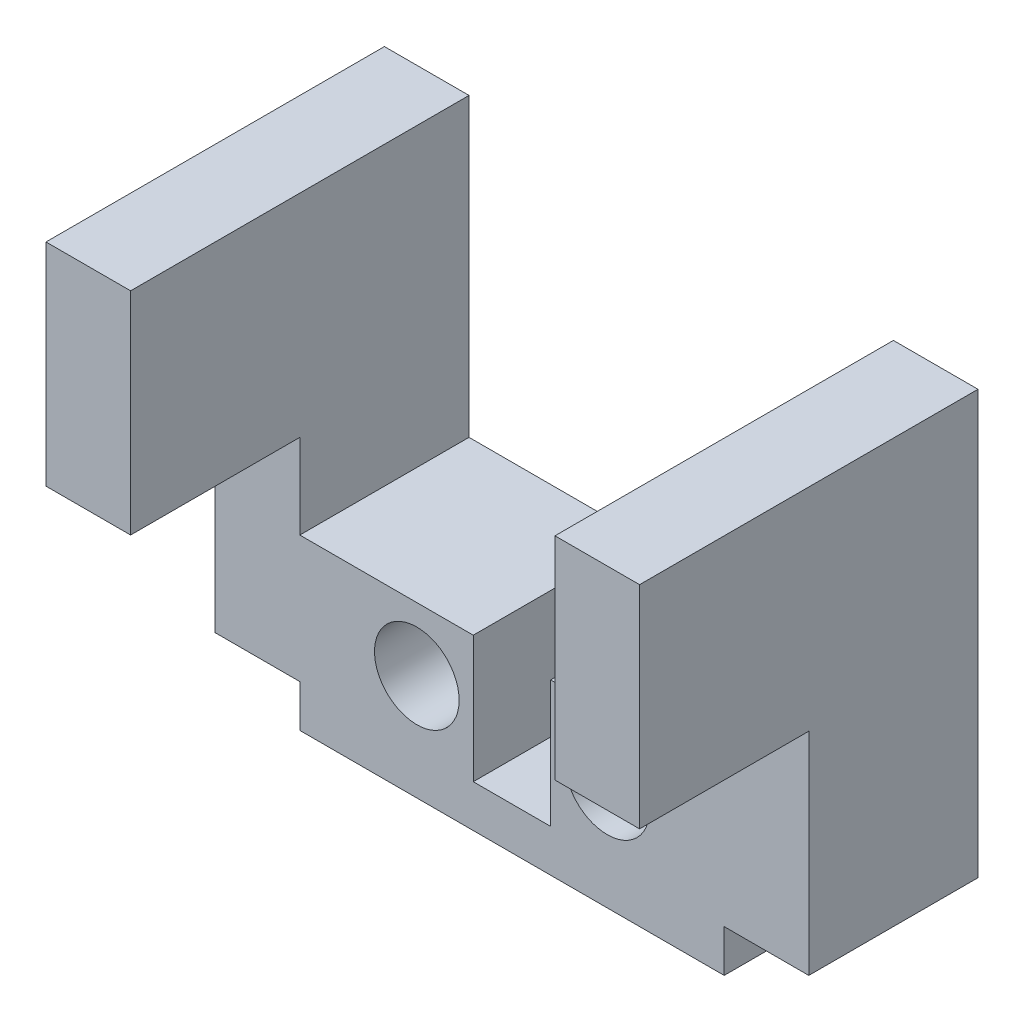
ISO-10303-21;
HEADER;
FILE_DESCRIPTION(('STEP AP214'),'2;1');
FILE_NAME('part.step','',(''),(''),'','','');
FILE_SCHEMA(('AUTOMOTIVE_DESIGN { 1 0 10303 214 1 1 1 1 }'));
ENDSEC;
DATA;
#1=APPLICATION_CONTEXT('core data for automotive mechanical design processes');
#2=APPLICATION_PROTOCOL_DEFINITION('international standard','automotive_design',2000,#1);
#3=PRODUCT_CONTEXT('',#1,'mechanical');
#4=PRODUCT('Part','Part','',(#3));
#5=PRODUCT_RELATED_PRODUCT_CATEGORY('part','',(#4));
#6=PRODUCT_DEFINITION_FORMATION('','',#4);
#7=PRODUCT_DEFINITION_CONTEXT('part definition',#1,'design');
#8=PRODUCT_DEFINITION('design','',#6,#7);
#9=PRODUCT_DEFINITION_SHAPE('','',#8);
#10=(LENGTH_UNIT() NAMED_UNIT(*) SI_UNIT(.MILLI.,.METRE.));
#11=(NAMED_UNIT(*) PLANE_ANGLE_UNIT() SI_UNIT($,.RADIAN.));
#12=(NAMED_UNIT(*) SI_UNIT($,.STERADIAN.) SOLID_ANGLE_UNIT());
#13=UNCERTAINTY_MEASURE_WITH_UNIT(LENGTH_MEASURE(1.E-05),#10,'distance_accuracy_value','');
#14=(GEOMETRIC_REPRESENTATION_CONTEXT(3) GLOBAL_UNCERTAINTY_ASSIGNED_CONTEXT((#13)) GLOBAL_UNIT_ASSIGNED_CONTEXT((#10,
#11,#12)) REPRESENTATION_CONTEXT('',''));
#15=CARTESIAN_POINT('',(0.,0.,0.));
#16=DIRECTION('',(0.,0.,1.));
#17=DIRECTION('',(1.,0.,0.));
#18=AXIS2_PLACEMENT_3D('',#15,#16,#17);
#19=CARTESIAN_POINT('',(0.,0.,8.));
#20=DIRECTION('',(0.,0.,-1.));
#21=DIRECTION('',(-1.,0.,0.));
#22=AXIS2_PLACEMENT_3D('',#19,#20,#21);
#23=PLANE('',#22);
#24=CARTESIAN_POINT('',(-4.5,0.,8.));
#25=DIRECTION('',(0.,0.,1.));
#26=DIRECTION('',(1.,0.,0.));
#27=AXIS2_PLACEMENT_3D('',#24,#25,#26);
#28=CIRCLE('',#27,2.);
#29=CARTESIAN_POINT('',(-2.5,0.,8.));
#30=VERTEX_POINT('',#29);
#31=EDGE_CURVE('E249',#30,#30,#28,.T.);
#32=ORIENTED_EDGE('',*,*,#31,.F.);
#33=EDGE_LOOP('',(#32));
#34=FACE_BOUND('',#33,.T.);
#35=CARTESIAN_POINT('',(4.5,0.,8.));
#36=DIRECTION('',(0.,0.,1.));
#37=DIRECTION('',(-1.,0.,0.));
#38=AXIS2_PLACEMENT_3D('',#35,#36,#37);
#39=CIRCLE('',#38,2.);
#40=CARTESIAN_POINT('',(2.5,0.,8.));
#41=VERTEX_POINT('',#40);
#42=EDGE_CURVE('E241',#41,#41,#39,.T.);
#43=ORIENTED_EDGE('',*,*,#42,.F.);
#44=EDGE_LOOP('',(#43));
#45=FACE_BOUND('',#44,.T.);
#46=DIRECTION('',(1.,0.,0.));
#47=VECTOR('',#46,1.);
#48=CARTESIAN_POINT('',(14.0312899135856,7.,8.));
#49=LINE('',#48,#47);
#50=CARTESIAN_POINT('',(10.0312899135856,7.,8.));
#51=VERTEX_POINT('',#50);
#52=CARTESIAN_POINT('',(14.0312899135856,7.,8.));
#53=VERTEX_POINT('',#52);
#54=EDGE_CURVE('E199',#51,#53,#49,.T.);
#55=ORIENTED_EDGE('',*,*,#54,.F.);
#56=DIRECTION('',(0.,-1.,0.));
#57=VECTOR('',#56,1.);
#58=CARTESIAN_POINT('',(10.0312899135856,3.,8.));
#59=LINE('',#58,#57);
#60=CARTESIAN_POINT('',(10.0312899135856,3.,8.));
#61=VERTEX_POINT('',#60);
#62=EDGE_CURVE('E258',#51,#61,#59,.T.);
#63=ORIENTED_EDGE('',*,*,#62,.T.);
#64=DIRECTION('',(-1.,0.,0.));
#65=VECTOR('',#64,1.);
#66=CARTESIAN_POINT('',(1.83128991358563,3.,8.));
#67=LINE('',#66,#65);
#68=CARTESIAN_POINT('',(1.83128991358563,3.,8.));
#69=VERTEX_POINT('',#68);
#70=EDGE_CURVE('E262',#61,#69,#67,.T.);
#71=ORIENTED_EDGE('',*,*,#70,.T.);
#72=DIRECTION('',(0.,-1.,0.));
#73=VECTOR('',#72,1.);
#74=CARTESIAN_POINT('',(1.83128991358563,-3.,8.));
#75=LINE('',#74,#73);
#76=CARTESIAN_POINT('',(1.83128991358563,-3.,8.));
#77=VERTEX_POINT('',#76);
#78=EDGE_CURVE('E265',#69,#77,#75,.T.);
#79=ORIENTED_EDGE('',*,*,#78,.T.);
#80=DIRECTION('',(-1.,0.,0.));
#81=VECTOR('',#80,1.);
#82=CARTESIAN_POINT('',(1.83128991358563,-3.,8.));
#83=LINE('',#82,#81);
#84=CARTESIAN_POINT('',(-1.83128991358563,-3.,8.));
#85=VERTEX_POINT('',#84);
#86=EDGE_CURVE('E268',#77,#85,#83,.T.);
#87=ORIENTED_EDGE('',*,*,#86,.T.);
#88=DIRECTION('',(0.,1.,0.));
#89=VECTOR('',#88,1.);
#90=CARTESIAN_POINT('',(-1.83128991358563,-3.,8.));
#91=LINE('',#90,#89);
#92=CARTESIAN_POINT('',(-1.83128991358563,3.,8.));
#93=VERTEX_POINT('',#92);
#94=EDGE_CURVE('E271',#85,#93,#91,.T.);
#95=ORIENTED_EDGE('',*,*,#94,.T.);
#96=DIRECTION('',(-1.,0.,0.));
#97=VECTOR('',#96,1.);
#98=CARTESIAN_POINT('',(-1.83128991358563,3.,8.));
#99=LINE('',#98,#97);
#100=CARTESIAN_POINT('',(-10.0312899135856,3.,8.));
#101=VERTEX_POINT('',#100);
#102=EDGE_CURVE('E274',#93,#101,#99,.T.);
#103=ORIENTED_EDGE('',*,*,#102,.T.);
#104=DIRECTION('',(0.,1.,0.));
#105=VECTOR('',#104,1.);
#106=CARTESIAN_POINT('',(-10.0312899135856,3.,8.));
#107=LINE('',#106,#105);
#108=CARTESIAN_POINT('',(-10.0312899135856,7.,8.));
#109=VERTEX_POINT('',#108);
#110=EDGE_CURVE('E277',#101,#109,#107,.T.);
#111=ORIENTED_EDGE('',*,*,#110,.T.);
#112=DIRECTION('',(1.,0.,0.));
#113=VECTOR('',#112,1.);
#114=CARTESIAN_POINT('',(-14.0312899135856,7.,8.));
#115=LINE('',#114,#113);
#116=CARTESIAN_POINT('',(-14.0312899135856,7.,8.));
#117=VERTEX_POINT('',#116);
#118=EDGE_CURVE('E62',#117,#109,#115,.T.);
#119=ORIENTED_EDGE('',*,*,#118,.F.);
#120=DIRECTION('',(0.,-1.,0.));
#121=VECTOR('',#120,1.);
#122=CARTESIAN_POINT('',(-14.0312899135856,-3.,8.));
#123=LINE('',#122,#121);
#124=CARTESIAN_POINT('',(-14.0312899135856,-3.,8.));
#125=VERTEX_POINT('',#124);
#126=EDGE_CURVE('E280',#117,#125,#123,.T.);
#127=ORIENTED_EDGE('',*,*,#126,.T.);
#128=DIRECTION('',(1.,0.,0.));
#129=VECTOR('',#128,1.);
#130=CARTESIAN_POINT('',(-10.0312899135856,-3.,8.));
#131=LINE('',#130,#129);
#132=CARTESIAN_POINT('',(-10.0312899135856,-3.,8.));
#133=VERTEX_POINT('',#132);
#134=EDGE_CURVE('E283',#125,#133,#131,.T.);
#135=ORIENTED_EDGE('',*,*,#134,.T.);
#136=DIRECTION('',(0.,-1.,0.));
#137=VECTOR('',#136,1.);
#138=CARTESIAN_POINT('',(-10.0312899135856,-3.,8.));
#139=LINE('',#138,#137);
#140=CARTESIAN_POINT('',(-10.0312899135856,-5.,8.));
#141=VERTEX_POINT('',#140);
#142=EDGE_CURVE('E286',#133,#141,#139,.T.);
#143=ORIENTED_EDGE('',*,*,#142,.T.);
#144=DIRECTION('',(1.,0.,0.));
#145=VECTOR('',#144,1.);
#146=CARTESIAN_POINT('',(-10.0312899135856,-5.,8.));
#147=LINE('',#146,#145);
#148=CARTESIAN_POINT('',(10.0312899135856,-5.,8.));
#149=VERTEX_POINT('',#148);
#150=EDGE_CURVE('E289',#141,#149,#147,.T.);
#151=ORIENTED_EDGE('',*,*,#150,.T.);
#152=DIRECTION('',(0.,1.,0.));
#153=VECTOR('',#152,1.);
#154=CARTESIAN_POINT('',(10.0312899135856,-5.,8.));
#155=LINE('',#154,#153);
#156=CARTESIAN_POINT('',(10.0312899135856,-3.,8.));
#157=VERTEX_POINT('',#156);
#158=EDGE_CURVE('E292',#149,#157,#155,.T.);
#159=ORIENTED_EDGE('',*,*,#158,.T.);
#160=DIRECTION('',(1.,0.,0.));
#161=VECTOR('',#160,1.);
#162=CARTESIAN_POINT('',(10.0312899135856,-3.,8.));
#163=LINE('',#162,#161);
#164=CARTESIAN_POINT('',(14.0312899135856,-3.,8.));
#165=VERTEX_POINT('',#164);
#166=EDGE_CURVE('E295',#157,#165,#163,.T.);
#167=ORIENTED_EDGE('',*,*,#166,.T.);
#168=DIRECTION('',(0.,1.,0.));
#169=VECTOR('',#168,1.);
#170=CARTESIAN_POINT('',(14.0312899135856,-3.,8.));
#171=LINE('',#170,#169);
#172=EDGE_CURVE('E55',#165,#53,#171,.T.);
#173=ORIENTED_EDGE('',*,*,#172,.T.);
#174=EDGE_LOOP('',(#55,#63,#71,#79,#87,#95,#103,#111,#119,#127,#135,#143,#151,#159,#167,#173));
#175=FACE_BOUND('',#174,.T.);
#176=ADVANCED_FACE('F39',(#34,#45,#175),#23,.F.);
#177=CARTESIAN_POINT('',(0.,0.,0.));
#178=DIRECTION('',(0.,0.,-1.));
#179=DIRECTION('',(-1.,0.,0.));
#180=AXIS2_PLACEMENT_3D('',#177,#178,#179);
#181=PLANE('',#180);
#182=CARTESIAN_POINT('',(-4.5,0.,0.));
#183=DIRECTION('',(0.,0.,1.));
#184=DIRECTION('',(1.,0.,0.));
#185=AXIS2_PLACEMENT_3D('',#182,#183,#184);
#186=CIRCLE('',#185,2.);
#187=CARTESIAN_POINT('',(-2.5,0.,0.));
#188=VERTEX_POINT('',#187);
#189=EDGE_CURVE('E245',#188,#188,#186,.T.);
#190=ORIENTED_EDGE('',*,*,#189,.T.);
#191=EDGE_LOOP('',(#190));
#192=FACE_BOUND('',#191,.T.);
#193=DIRECTION('',(0.,1.,0.));
#194=VECTOR('',#193,1.);
#195=CARTESIAN_POINT('',(14.0312899135856,-3.,0.));
#196=LINE('',#195,#194);
#197=CARTESIAN_POINT('',(14.0312899135856,-3.,0.));
#198=VERTEX_POINT('',#197);
#199=CARTESIAN_POINT('',(14.0312899135856,17.,0.));
#200=VERTEX_POINT('',#199);
#201=EDGE_CURVE('E183',#198,#200,#196,.T.);
#202=ORIENTED_EDGE('',*,*,#201,.F.);
#203=DIRECTION('',(1.,0.,0.));
#204=VECTOR('',#203,1.);
#205=CARTESIAN_POINT('',(10.0312899135856,-3.,0.));
#206=LINE('',#205,#204);
#207=CARTESIAN_POINT('',(10.0312899135856,-3.,0.));
#208=VERTEX_POINT('',#207);
#209=EDGE_CURVE('E259',#208,#198,#206,.T.);
#210=ORIENTED_EDGE('',*,*,#209,.F.);
#211=DIRECTION('',(0.,1.,0.));
#212=VECTOR('',#211,1.);
#213=CARTESIAN_POINT('',(10.0312899135856,-5.,0.));
#214=LINE('',#213,#212);
#215=CARTESIAN_POINT('',(10.0312899135856,-5.,0.));
#216=VERTEX_POINT('',#215);
#217=EDGE_CURVE('E340',#216,#208,#214,.T.);
#218=ORIENTED_EDGE('',*,*,#217,.F.);
#219=DIRECTION('',(1.,0.,0.));
#220=VECTOR('',#219,1.);
#221=CARTESIAN_POINT('',(-10.0312899135856,-5.,0.));
#222=LINE('',#221,#220);
#223=CARTESIAN_POINT('',(-10.0312899135856,-5.,0.));
#224=VERTEX_POINT('',#223);
#225=EDGE_CURVE('E337',#224,#216,#222,.T.);
#226=ORIENTED_EDGE('',*,*,#225,.F.);
#227=DIRECTION('',(0.,-1.,0.));
#228=VECTOR('',#227,1.);
#229=CARTESIAN_POINT('',(-10.0312899135856,-3.,0.));
#230=LINE('',#229,#228);
#231=CARTESIAN_POINT('',(-10.0312899135856,-3.,0.));
#232=VERTEX_POINT('',#231);
#233=EDGE_CURVE('E334',#232,#224,#230,.T.);
#234=ORIENTED_EDGE('',*,*,#233,.F.);
#235=DIRECTION('',(1.,0.,0.));
#236=VECTOR('',#235,1.);
#237=CARTESIAN_POINT('',(-10.0312899135856,-3.,0.));
#238=LINE('',#237,#236);
#239=CARTESIAN_POINT('',(-14.0312899135856,-3.,0.));
#240=VERTEX_POINT('',#239);
#241=EDGE_CURVE('E331',#240,#232,#238,.T.);
#242=ORIENTED_EDGE('',*,*,#241,.F.);
#243=DIRECTION('',(0.,-1.,0.));
#244=VECTOR('',#243,1.);
#245=CARTESIAN_POINT('',(-14.0312899135856,-3.,0.));
#246=LINE('',#245,#244);
#247=CARTESIAN_POINT('',(-14.0312899135856,17.,0.));
#248=VERTEX_POINT('',#247);
#249=EDGE_CURVE('E328',#248,#240,#246,.T.);
#250=ORIENTED_EDGE('',*,*,#249,.F.);
#251=DIRECTION('',(-1.,0.,0.));
#252=VECTOR('',#251,1.);
#253=CARTESIAN_POINT('',(-10.0312899135856,17.,0.));
#254=LINE('',#253,#252);
#255=CARTESIAN_POINT('',(-10.0312899135856,17.,0.));
#256=VERTEX_POINT('',#255);
#257=EDGE_CURVE('E325',#256,#248,#254,.T.);
#258=ORIENTED_EDGE('',*,*,#257,.F.);
#259=DIRECTION('',(0.,1.,0.));
#260=VECTOR('',#259,1.);
#261=CARTESIAN_POINT('',(-10.0312899135856,3.,0.));
#262=LINE('',#261,#260);
#263=CARTESIAN_POINT('',(-10.0312899135856,3.,0.));
#264=VERTEX_POINT('',#263);
#265=EDGE_CURVE('E322',#264,#256,#262,.T.);
#266=ORIENTED_EDGE('',*,*,#265,.F.);
#267=DIRECTION('',(-1.,0.,0.));
#268=VECTOR('',#267,1.);
#269=CARTESIAN_POINT('',(-1.83128991358563,3.,0.));
#270=LINE('',#269,#268);
#271=CARTESIAN_POINT('',(-1.83128991358563,3.,0.));
#272=VERTEX_POINT('',#271);
#273=EDGE_CURVE('E319',#272,#264,#270,.T.);
#274=ORIENTED_EDGE('',*,*,#273,.F.);
#275=DIRECTION('',(0.,1.,0.));
#276=VECTOR('',#275,1.);
#277=CARTESIAN_POINT('',(-1.83128991358563,-3.,0.));
#278=LINE('',#277,#276);
#279=CARTESIAN_POINT('',(-1.83128991358563,-3.,0.));
#280=VERTEX_POINT('',#279);
#281=EDGE_CURVE('E316',#280,#272,#278,.T.);
#282=ORIENTED_EDGE('',*,*,#281,.F.);
#283=DIRECTION('',(-1.,0.,0.));
#284=VECTOR('',#283,1.);
#285=CARTESIAN_POINT('',(1.83128991358563,-3.,0.));
#286=LINE('',#285,#284);
#287=CARTESIAN_POINT('',(1.83128991358563,-3.,0.));
#288=VERTEX_POINT('',#287);
#289=EDGE_CURVE('E313',#288,#280,#286,.T.);
#290=ORIENTED_EDGE('',*,*,#289,.F.);
#291=DIRECTION('',(0.,-1.,0.));
#292=VECTOR('',#291,1.);
#293=CARTESIAN_POINT('',(1.83128991358563,-3.,0.));
#294=LINE('',#293,#292);
#295=CARTESIAN_POINT('',(1.83128991358563,3.,0.));
#296=VERTEX_POINT('',#295);
#297=EDGE_CURVE('E310',#296,#288,#294,.T.);
#298=ORIENTED_EDGE('',*,*,#297,.F.);
#299=DIRECTION('',(-1.,0.,0.));
#300=VECTOR('',#299,1.);
#301=CARTESIAN_POINT('',(1.83128991358563,3.,0.));
#302=LINE('',#301,#300);
#303=CARTESIAN_POINT('',(10.0312899135856,3.,0.));
#304=VERTEX_POINT('',#303);
#305=EDGE_CURVE('E307',#304,#296,#302,.T.);
#306=ORIENTED_EDGE('',*,*,#305,.F.);
#307=DIRECTION('',(0.,-1.,0.));
#308=VECTOR('',#307,1.);
#309=CARTESIAN_POINT('',(10.0312899135856,3.,0.));
#310=LINE('',#309,#308);
#311=CARTESIAN_POINT('',(10.0312899135856,17.,0.));
#312=VERTEX_POINT('',#311);
#313=EDGE_CURVE('E304',#312,#304,#310,.T.);
#314=ORIENTED_EDGE('',*,*,#313,.F.);
#315=DIRECTION('',(-1.,0.,0.));
#316=VECTOR('',#315,1.);
#317=CARTESIAN_POINT('',(10.0312899135856,17.,0.));
#318=LINE('',#317,#316);
#319=EDGE_CURVE('E301',#200,#312,#318,.T.);
#320=ORIENTED_EDGE('',*,*,#319,.F.);
#321=EDGE_LOOP('',(#202,#210,#218,#226,#234,#242,#250,#258,#266,#274,#282,#290,#298,#306,#314,#320));
#322=FACE_BOUND('',#321,.T.);
#323=CARTESIAN_POINT('',(4.5,0.,0.));
#324=DIRECTION('',(0.,0.,1.));
#325=DIRECTION('',(-1.,0.,0.));
#326=AXIS2_PLACEMENT_3D('',#323,#324,#325);
#327=CIRCLE('',#326,2.);
#328=CARTESIAN_POINT('',(2.5,0.,0.));
#329=VERTEX_POINT('',#328);
#330=EDGE_CURVE('E240',#329,#329,#327,.T.);
#331=ORIENTED_EDGE('',*,*,#330,.T.);
#332=EDGE_LOOP('',(#331));
#333=FACE_BOUND('',#332,.T.);
#334=ADVANCED_FACE('F406',(#192,#322,#333),#181,.T.);
#335=CARTESIAN_POINT('',(14.0312899135856,-3.,8.));
#336=DIRECTION('',(-1.,0.,0.));
#337=DIRECTION('',(0.,0.,1.));
#338=AXIS2_PLACEMENT_3D('',#335,#336,#337);
#339=PLANE('',#338);
#340=ORIENTED_EDGE('',*,*,#201,.T.);
#341=DIRECTION('',(0.,0.,-1.));
#342=VECTOR('',#341,1.);
#343=CARTESIAN_POINT('',(14.0312899135856,17.,8.));
#344=LINE('',#343,#342);
#345=CARTESIAN_POINT('',(14.0312899135856,17.,16.));
#346=VERTEX_POINT('',#345);
#347=EDGE_CURVE('E11',#346,#200,#344,.T.);
#348=ORIENTED_EDGE('',*,*,#347,.F.);
#349=DIRECTION('',(0.,1.,0.));
#350=VECTOR('',#349,1.);
#351=CARTESIAN_POINT('',(14.0312899135856,17.,16.));
#352=LINE('',#351,#350);
#353=CARTESIAN_POINT('',(14.0312899135856,7.,16.));
#354=VERTEX_POINT('',#353);
#355=EDGE_CURVE('E180',#354,#346,#352,.T.);
#356=ORIENTED_EDGE('',*,*,#355,.F.);
#357=DIRECTION('',(0.,0.,-1.));
#358=VECTOR('',#357,1.);
#359=CARTESIAN_POINT('',(14.0312899135856,7.,16.));
#360=LINE('',#359,#358);
#361=EDGE_CURVE('E207',#354,#53,#360,.T.);
#362=ORIENTED_EDGE('',*,*,#361,.T.);
#363=ORIENTED_EDGE('',*,*,#172,.F.);
#364=DIRECTION('',(0.,0.,-1.));
#365=VECTOR('',#364,1.);
#366=CARTESIAN_POINT('',(14.0312899135856,-3.,8.));
#367=LINE('',#366,#365);
#368=EDGE_CURVE('E298',#165,#198,#367,.T.);
#369=ORIENTED_EDGE('',*,*,#368,.T.);
#370=EDGE_LOOP('',(#340,#348,#356,#362,#363,#369));
#371=FACE_BOUND('',#370,.T.);
#372=ADVANCED_FACE('F41',(#371),#339,.F.);
#373=CARTESIAN_POINT('',(10.0312899135856,17.,8.));
#374=DIRECTION('',(0.,-1.,0.));
#375=DIRECTION('',(1.,0.,0.));
#376=AXIS2_PLACEMENT_3D('',#373,#374,#375);
#377=PLANE('',#376);
#378=ORIENTED_EDGE('',*,*,#319,.T.);
#379=DIRECTION('',(0.,0.,-1.));
#380=VECTOR('',#379,1.);
#381=CARTESIAN_POINT('',(10.0312899135856,17.,8.));
#382=LINE('',#381,#380);
#383=CARTESIAN_POINT('',(10.0312899135856,17.,16.));
#384=VERTEX_POINT('',#383);
#385=EDGE_CURVE('E48',#384,#312,#382,.T.);
#386=ORIENTED_EDGE('',*,*,#385,.F.);
#387=DIRECTION('',(-1.,0.,0.));
#388=VECTOR('',#387,1.);
#389=CARTESIAN_POINT('',(14.0312899135856,17.,16.));
#390=LINE('',#389,#388);
#391=EDGE_CURVE('E186',#346,#384,#390,.T.);
#392=ORIENTED_EDGE('',*,*,#391,.F.);
#393=ORIENTED_EDGE('',*,*,#347,.T.);
#394=EDGE_LOOP('',(#378,#386,#392,#393));
#395=FACE_BOUND('',#394,.T.);
#396=ADVANCED_FACE('F187',(#395),#377,.F.);
#397=CARTESIAN_POINT('',(10.0312899135856,3.,8.));
#398=DIRECTION('',(1.,0.,0.));
#399=DIRECTION('',(0.,0.,-1.));
#400=AXIS2_PLACEMENT_3D('',#397,#398,#399);
#401=PLANE('',#400);
#402=ORIENTED_EDGE('',*,*,#313,.T.);
#403=DIRECTION('',(0.,0.,-1.));
#404=VECTOR('',#403,1.);
#405=CARTESIAN_POINT('',(10.0312899135856,3.,8.));
#406=LINE('',#405,#404);
#407=EDGE_CURVE('E395',#61,#304,#406,.T.);
#408=ORIENTED_EDGE('',*,*,#407,.F.);
#409=ORIENTED_EDGE('',*,*,#62,.F.);
#410=DIRECTION('',(0.,0.,-1.));
#411=VECTOR('',#410,1.);
#412=CARTESIAN_POINT('',(10.0312899135856,7.,16.));
#413=LINE('',#412,#411);
#414=CARTESIAN_POINT('',(10.0312899135856,7.,16.));
#415=VERTEX_POINT('',#414);
#416=EDGE_CURVE('E211',#415,#51,#413,.T.);
#417=ORIENTED_EDGE('',*,*,#416,.F.);
#418=DIRECTION('',(0.,-1.,0.));
#419=VECTOR('',#418,1.);
#420=CARTESIAN_POINT('',(10.0312899135856,17.,16.));
#421=LINE('',#420,#419);
#422=EDGE_CURVE('E192',#384,#415,#421,.T.);
#423=ORIENTED_EDGE('',*,*,#422,.F.);
#424=ORIENTED_EDGE('',*,*,#385,.T.);
#425=EDGE_LOOP('',(#402,#408,#409,#417,#423,#424));
#426=FACE_BOUND('',#425,.T.);
#427=ADVANCED_FACE('F401',(#426),#401,.F.);
#428=CARTESIAN_POINT('',(1.83128991358563,3.,8.));
#429=DIRECTION('',(0.,-1.,0.));
#430=DIRECTION('',(1.,0.,0.));
#431=AXIS2_PLACEMENT_3D('',#428,#429,#430);
#432=PLANE('',#431);
#433=ORIENTED_EDGE('',*,*,#305,.T.);
#434=DIRECTION('',(0.,0.,-1.));
#435=VECTOR('',#434,1.);
#436=CARTESIAN_POINT('',(1.83128991358563,3.,8.));
#437=LINE('',#436,#435);
#438=EDGE_CURVE('E391',#69,#296,#437,.T.);
#439=ORIENTED_EDGE('',*,*,#438,.F.);
#440=ORIENTED_EDGE('',*,*,#70,.F.);
#441=ORIENTED_EDGE('',*,*,#407,.T.);
#442=EDGE_LOOP('',(#433,#439,#440,#441));
#443=FACE_BOUND('',#442,.T.);
#444=ADVANCED_FACE('F412',(#443),#432,.F.);
#445=CARTESIAN_POINT('',(1.83128991358563,-3.,8.));
#446=DIRECTION('',(1.,0.,0.));
#447=DIRECTION('',(0.,0.,-1.));
#448=AXIS2_PLACEMENT_3D('',#445,#446,#447);
#449=PLANE('',#448);
#450=ORIENTED_EDGE('',*,*,#297,.T.);
#451=DIRECTION('',(0.,0.,-1.));
#452=VECTOR('',#451,1.);
#453=CARTESIAN_POINT('',(1.83128991358563,-3.,8.));
#454=LINE('',#453,#452);
#455=EDGE_CURVE('E387',#77,#288,#454,.T.);
#456=ORIENTED_EDGE('',*,*,#455,.F.);
#457=ORIENTED_EDGE('',*,*,#78,.F.);
#458=ORIENTED_EDGE('',*,*,#438,.T.);
#459=EDGE_LOOP('',(#450,#456,#457,#458));
#460=FACE_BOUND('',#459,.T.);
#461=ADVANCED_FACE('F416',(#460),#449,.F.);
#462=CARTESIAN_POINT('',(1.83128991358563,-3.,8.));
#463=DIRECTION('',(0.,-1.,0.));
#464=DIRECTION('',(0.,0.,-1.));
#465=AXIS2_PLACEMENT_3D('',#462,#463,#464);
#466=PLANE('',#465);
#467=ORIENTED_EDGE('',*,*,#289,.T.);
#468=DIRECTION('',(0.,0.,-1.));
#469=VECTOR('',#468,1.);
#470=CARTESIAN_POINT('',(-1.83128991358563,-3.,8.));
#471=LINE('',#470,#469);
#472=EDGE_CURVE('E383',#85,#280,#471,.T.);
#473=ORIENTED_EDGE('',*,*,#472,.F.);
#474=ORIENTED_EDGE('',*,*,#86,.F.);
#475=ORIENTED_EDGE('',*,*,#455,.T.);
#476=EDGE_LOOP('',(#467,#473,#474,#475));
#477=FACE_BOUND('',#476,.T.);
#478=ADVANCED_FACE('F478',(#477),#466,.F.);
#479=CARTESIAN_POINT('',(-1.83128991358563,-3.,8.));
#480=DIRECTION('',(-1.,0.,0.));
#481=DIRECTION('',(0.,0.,1.));
#482=AXIS2_PLACEMENT_3D('',#479,#480,#481);
#483=PLANE('',#482);
#484=ORIENTED_EDGE('',*,*,#281,.T.);
#485=DIRECTION('',(0.,0.,-1.));
#486=VECTOR('',#485,1.);
#487=CARTESIAN_POINT('',(-1.83128991358563,3.,8.));
#488=LINE('',#487,#486);
#489=EDGE_CURVE('E379',#93,#272,#488,.T.);
#490=ORIENTED_EDGE('',*,*,#489,.F.);
#491=ORIENTED_EDGE('',*,*,#94,.F.);
#492=ORIENTED_EDGE('',*,*,#472,.T.);
#493=EDGE_LOOP('',(#484,#490,#491,#492));
#494=FACE_BOUND('',#493,.T.);
#495=ADVANCED_FACE('F476',(#494),#483,.F.);
#496=CARTESIAN_POINT('',(-1.83128991358563,3.,8.));
#497=DIRECTION('',(0.,-1.,0.));
#498=DIRECTION('',(1.,0.,0.));
#499=AXIS2_PLACEMENT_3D('',#496,#497,#498);
#500=PLANE('',#499);
#501=ORIENTED_EDGE('',*,*,#273,.T.);
#502=DIRECTION('',(0.,0.,-1.));
#503=VECTOR('',#502,1.);
#504=CARTESIAN_POINT('',(-10.0312899135856,3.,8.));
#505=LINE('',#504,#503);
#506=EDGE_CURVE('E375',#101,#264,#505,.T.);
#507=ORIENTED_EDGE('',*,*,#506,.F.);
#508=ORIENTED_EDGE('',*,*,#102,.F.);
#509=ORIENTED_EDGE('',*,*,#489,.T.);
#510=EDGE_LOOP('',(#501,#507,#508,#509));
#511=FACE_BOUND('',#510,.T.);
#512=ADVANCED_FACE('F473',(#511),#500,.F.);
#513=CARTESIAN_POINT('',(-10.0312899135856,3.,8.));
#514=DIRECTION('',(-1.,0.,0.));
#515=DIRECTION('',(0.,0.,1.));
#516=AXIS2_PLACEMENT_3D('',#513,#514,#515);
#517=PLANE('',#516);
#518=ORIENTED_EDGE('',*,*,#265,.T.);
#519=DIRECTION('',(0.,0.,-1.));
#520=VECTOR('',#519,1.);
#521=CARTESIAN_POINT('',(-10.0312899135856,17.,8.));
#522=LINE('',#521,#520);
#523=CARTESIAN_POINT('',(-10.0312899135856,17.,16.));
#524=VERTEX_POINT('',#523);
#525=EDGE_CURVE('E371',#524,#256,#522,.T.);
#526=ORIENTED_EDGE('',*,*,#525,.F.);
#527=DIRECTION('',(0.,1.,0.));
#528=VECTOR('',#527,1.);
#529=CARTESIAN_POINT('',(-10.0312899135856,17.,16.));
#530=LINE('',#529,#528);
#531=CARTESIAN_POINT('',(-10.0312899135856,7.,16.));
#532=VERTEX_POINT('',#531);
#533=EDGE_CURVE('E222',#532,#524,#530,.T.);
#534=ORIENTED_EDGE('',*,*,#533,.F.);
#535=DIRECTION('',(0.,0.,-1.));
#536=VECTOR('',#535,1.);
#537=CARTESIAN_POINT('',(-10.0312899135856,7.,16.));
#538=LINE('',#537,#536);
#539=EDGE_CURVE('E230',#532,#109,#538,.T.);
#540=ORIENTED_EDGE('',*,*,#539,.T.);
#541=ORIENTED_EDGE('',*,*,#110,.F.);
#542=ORIENTED_EDGE('',*,*,#506,.T.);
#543=EDGE_LOOP('',(#518,#526,#534,#540,#541,#542));
#544=FACE_BOUND('',#543,.T.);
#545=ADVANCED_FACE('F461',(#544),#517,.F.);
#546=CARTESIAN_POINT('',(-10.0312899135856,17.,8.));
#547=DIRECTION('',(0.,-1.,0.));
#548=DIRECTION('',(1.,0.,0.));
#549=AXIS2_PLACEMENT_3D('',#546,#547,#548);
#550=PLANE('',#549);
#551=ORIENTED_EDGE('',*,*,#257,.T.);
#552=DIRECTION('',(0.,0.,-1.));
#553=VECTOR('',#552,1.);
#554=CARTESIAN_POINT('',(-14.0312899135856,17.,8.));
#555=LINE('',#554,#553);
#556=CARTESIAN_POINT('',(-14.0312899135856,17.,16.));
#557=VERTEX_POINT('',#556);
#558=EDGE_CURVE('E367',#557,#248,#555,.T.);
#559=ORIENTED_EDGE('',*,*,#558,.F.);
#560=DIRECTION('',(-1.,0.,0.));
#561=VECTOR('',#560,1.);
#562=CARTESIAN_POINT('',(-14.0312899135856,17.,16.));
#563=LINE('',#562,#561);
#564=EDGE_CURVE('E226',#524,#557,#563,.T.);
#565=ORIENTED_EDGE('',*,*,#564,.F.);
#566=ORIENTED_EDGE('',*,*,#525,.T.);
#567=EDGE_LOOP('',(#551,#559,#565,#566));
#568=FACE_BOUND('',#567,.T.);
#569=ADVANCED_FACE('F457',(#568),#550,.F.);
#570=CARTESIAN_POINT('',(-14.0312899135856,-3.,8.));
#571=DIRECTION('',(1.,0.,0.));
#572=DIRECTION('',(0.,0.,-1.));
#573=AXIS2_PLACEMENT_3D('',#570,#571,#572);
#574=PLANE('',#573);
#575=ORIENTED_EDGE('',*,*,#249,.T.);
#576=DIRECTION('',(0.,0.,-1.));
#577=VECTOR('',#576,1.);
#578=CARTESIAN_POINT('',(-14.0312899135856,-3.,8.));
#579=LINE('',#578,#577);
#580=EDGE_CURVE('E363',#125,#240,#579,.T.);
#581=ORIENTED_EDGE('',*,*,#580,.F.);
#582=ORIENTED_EDGE('',*,*,#126,.F.);
#583=DIRECTION('',(0.,0.,-1.));
#584=VECTOR('',#583,1.);
#585=CARTESIAN_POINT('',(-14.0312899135856,7.,16.));
#586=LINE('',#585,#584);
#587=CARTESIAN_POINT('',(-14.0312899135856,7.,16.));
#588=VERTEX_POINT('',#587);
#589=EDGE_CURVE('E236',#588,#117,#586,.T.);
#590=ORIENTED_EDGE('',*,*,#589,.F.);
#591=DIRECTION('',(0.,-1.,0.));
#592=VECTOR('',#591,1.);
#593=CARTESIAN_POINT('',(-14.0312899135856,17.,16.));
#594=LINE('',#593,#592);
#595=EDGE_CURVE('E215',#557,#588,#594,.T.);
#596=ORIENTED_EDGE('',*,*,#595,.F.);
#597=ORIENTED_EDGE('',*,*,#558,.T.);
#598=EDGE_LOOP('',(#575,#581,#582,#590,#596,#597));
#599=FACE_BOUND('',#598,.T.);
#600=ADVANCED_FACE('F450',(#599),#574,.F.);
#601=CARTESIAN_POINT('',(-10.0312899135856,-3.,8.));
#602=DIRECTION('',(0.,1.,0.));
#603=DIRECTION('',(0.,0.,1.));
#604=AXIS2_PLACEMENT_3D('',#601,#602,#603);
#605=PLANE('',#604);
#606=ORIENTED_EDGE('',*,*,#241,.T.);
#607=DIRECTION('',(0.,0.,-1.));
#608=VECTOR('',#607,1.);
#609=CARTESIAN_POINT('',(-10.0312899135856,-3.,8.));
#610=LINE('',#609,#608);
#611=EDGE_CURVE('E359',#133,#232,#610,.T.);
#612=ORIENTED_EDGE('',*,*,#611,.F.);
#613=ORIENTED_EDGE('',*,*,#134,.F.);
#614=ORIENTED_EDGE('',*,*,#580,.T.);
#615=EDGE_LOOP('',(#606,#612,#613,#614));
#616=FACE_BOUND('',#615,.T.);
#617=ADVANCED_FACE('F447',(#616),#605,.F.);
#618=CARTESIAN_POINT('',(-10.0312899135856,-3.,8.));
#619=DIRECTION('',(1.,0.,0.));
#620=DIRECTION('',(0.,1.,0.));
#621=AXIS2_PLACEMENT_3D('',#618,#619,#620);
#622=PLANE('',#621);
#623=ORIENTED_EDGE('',*,*,#233,.T.);
#624=DIRECTION('',(0.,0.,-1.));
#625=VECTOR('',#624,1.);
#626=CARTESIAN_POINT('',(-10.0312899135856,-5.,8.));
#627=LINE('',#626,#625);
#628=EDGE_CURVE('E355',#141,#224,#627,.T.);
#629=ORIENTED_EDGE('',*,*,#628,.F.);
#630=ORIENTED_EDGE('',*,*,#142,.F.);
#631=ORIENTED_EDGE('',*,*,#611,.T.);
#632=EDGE_LOOP('',(#623,#629,#630,#631));
#633=FACE_BOUND('',#632,.T.);
#634=ADVANCED_FACE('F442',(#633),#622,.F.);
#635=CARTESIAN_POINT('',(-10.0312899135856,-5.,8.));
#636=DIRECTION('',(0.,1.,0.));
#637=DIRECTION('',(0.,0.,1.));
#638=AXIS2_PLACEMENT_3D('',#635,#636,#637);
#639=PLANE('',#638);
#640=ORIENTED_EDGE('',*,*,#225,.T.);
#641=DIRECTION('',(0.,0.,-1.));
#642=VECTOR('',#641,1.);
#643=CARTESIAN_POINT('',(10.0312899135856,-5.,8.));
#644=LINE('',#643,#642);
#645=EDGE_CURVE('E351',#149,#216,#644,.T.);
#646=ORIENTED_EDGE('',*,*,#645,.F.);
#647=ORIENTED_EDGE('',*,*,#150,.F.);
#648=ORIENTED_EDGE('',*,*,#628,.T.);
#649=EDGE_LOOP('',(#640,#646,#647,#648));
#650=FACE_BOUND('',#649,.T.);
#651=ADVANCED_FACE('F436',(#650),#639,.F.);
#652=CARTESIAN_POINT('',(10.0312899135856,-5.,8.));
#653=DIRECTION('',(-1.,0.,0.));
#654=DIRECTION('',(0.,-1.,0.));
#655=AXIS2_PLACEMENT_3D('',#652,#653,#654);
#656=PLANE('',#655);
#657=ORIENTED_EDGE('',*,*,#217,.T.);
#658=DIRECTION('',(0.,0.,-1.));
#659=VECTOR('',#658,1.);
#660=CARTESIAN_POINT('',(10.0312899135856,-3.,8.));
#661=LINE('',#660,#659);
#662=EDGE_CURVE('E347',#157,#208,#661,.T.);
#663=ORIENTED_EDGE('',*,*,#662,.F.);
#664=ORIENTED_EDGE('',*,*,#158,.F.);
#665=ORIENTED_EDGE('',*,*,#645,.T.);
#666=EDGE_LOOP('',(#657,#663,#664,#665));
#667=FACE_BOUND('',#666,.T.);
#668=ADVANCED_FACE('F432',(#667),#656,.F.);
#669=CARTESIAN_POINT('',(10.0312899135856,-3.,8.));
#670=DIRECTION('',(0.,1.,0.));
#671=DIRECTION('',(0.,0.,1.));
#672=AXIS2_PLACEMENT_3D('',#669,#670,#671);
#673=PLANE('',#672);
#674=ORIENTED_EDGE('',*,*,#209,.T.);
#675=ORIENTED_EDGE('',*,*,#368,.F.);
#676=ORIENTED_EDGE('',*,*,#166,.F.);
#677=ORIENTED_EDGE('',*,*,#662,.T.);
#678=EDGE_LOOP('',(#674,#675,#676,#677));
#679=FACE_BOUND('',#678,.T.);
#680=ADVANCED_FACE('F428',(#679),#673,.F.);
#681=CARTESIAN_POINT('',(-4.5,0.,8.));
#682=DIRECTION('',(0.,0.,-1.));
#683=DIRECTION('',(-1.,0.,0.));
#684=AXIS2_PLACEMENT_3D('',#681,#682,#683);
#685=CYLINDRICAL_SURFACE('',#684,2.);
#686=ORIENTED_EDGE('',*,*,#31,.T.);
#687=EDGE_LOOP('',(#686));
#688=FACE_BOUND('',#687,.T.);
#689=ORIENTED_EDGE('',*,*,#189,.F.);
#690=EDGE_LOOP('',(#689));
#691=FACE_BOUND('',#690,.T.);
#692=ADVANCED_FACE('F498',(#688,#691),#685,.F.);
#693=CARTESIAN_POINT('',(4.5,0.,8.));
#694=DIRECTION('',(0.,0.,-1.));
#695=DIRECTION('',(-1.,0.,0.));
#696=AXIS2_PLACEMENT_3D('',#693,#694,#695);
#697=CYLINDRICAL_SURFACE('',#696,2.);
#698=ORIENTED_EDGE('',*,*,#42,.T.);
#699=EDGE_LOOP('',(#698));
#700=FACE_BOUND('',#699,.T.);
#701=ORIENTED_EDGE('',*,*,#330,.F.);
#702=EDGE_LOOP('',(#701));
#703=FACE_BOUND('',#702,.T.);
#704=ADVANCED_FACE('F562',(#700,#703),#697,.F.);
#705=CARTESIAN_POINT('',(-14.0312899135856,7.,16.));
#706=DIRECTION('',(0.,1.,0.));
#707=DIRECTION('',(0.,0.,1.));
#708=AXIS2_PLACEMENT_3D('',#705,#706,#707);
#709=PLANE('',#708);
#710=ORIENTED_EDGE('',*,*,#118,.T.);
#711=ORIENTED_EDGE('',*,*,#539,.F.);
#712=DIRECTION('',(1.,0.,0.));
#713=VECTOR('',#712,1.);
#714=CARTESIAN_POINT('',(-14.0312899135856,7.,16.));
#715=LINE('',#714,#713);
#716=EDGE_CURVE('E219',#588,#532,#715,.T.);
#717=ORIENTED_EDGE('',*,*,#716,.F.);
#718=ORIENTED_EDGE('',*,*,#589,.T.);
#719=EDGE_LOOP('',(#710,#711,#717,#718));
#720=FACE_BOUND('',#719,.T.);
#721=ADVANCED_FACE('F466',(#720),#709,.F.);
#722=CARTESIAN_POINT('',(0.,0.,16.));
#723=DIRECTION('',(0.,0.,1.));
#724=DIRECTION('',(1.,0.,0.));
#725=AXIS2_PLACEMENT_3D('',#722,#723,#724);
#726=PLANE('',#725);
#727=ORIENTED_EDGE('',*,*,#595,.T.);
#728=ORIENTED_EDGE('',*,*,#716,.T.);
#729=ORIENTED_EDGE('',*,*,#533,.T.);
#730=ORIENTED_EDGE('',*,*,#564,.T.);
#731=EDGE_LOOP('',(#727,#728,#729,#730));
#732=FACE_BOUND('',#731,.T.);
#733=ADVANCED_FACE('F463',(#732),#726,.T.);
#734=CARTESIAN_POINT('',(14.0312899135856,7.,16.));
#735=DIRECTION('',(0.,1.,0.));
#736=DIRECTION('',(0.,0.,1.));
#737=AXIS2_PLACEMENT_3D('',#734,#735,#736);
#738=PLANE('',#737);
#739=ORIENTED_EDGE('',*,*,#54,.T.);
#740=ORIENTED_EDGE('',*,*,#361,.F.);
#741=DIRECTION('',(1.,0.,0.));
#742=VECTOR('',#741,1.);
#743=CARTESIAN_POINT('',(14.0312899135856,7.,16.));
#744=LINE('',#743,#742);
#745=EDGE_CURVE('E196',#415,#354,#744,.T.);
#746=ORIENTED_EDGE('',*,*,#745,.F.);
#747=ORIENTED_EDGE('',*,*,#416,.T.);
#748=EDGE_LOOP('',(#739,#740,#746,#747));
#749=FACE_BOUND('',#748,.T.);
#750=ADVANCED_FACE('F421',(#749),#738,.F.);
#751=CARTESIAN_POINT('',(0.,0.,16.));
#752=DIRECTION('',(0.,0.,-1.));
#753=DIRECTION('',(-1.,0.,0.));
#754=AXIS2_PLACEMENT_3D('',#751,#752,#753);
#755=PLANE('',#754);
#756=ORIENTED_EDGE('',*,*,#355,.T.);
#757=ORIENTED_EDGE('',*,*,#391,.T.);
#758=ORIENTED_EDGE('',*,*,#422,.T.);
#759=ORIENTED_EDGE('',*,*,#745,.T.);
#760=EDGE_LOOP('',(#756,#757,#758,#759));
#761=FACE_BOUND('',#760,.T.);
#762=ADVANCED_FACE('F194',(#761),#755,.F.);
#763=CLOSED_SHELL('',(#176,#334,#372,#396,#427,#444,#461,#478,#495,#512,#545,#569,#600,#617,
#634,#651,#668,#680,#692,#704,#721,#733,#750,#762));
#764=MANIFOLD_SOLID_BREP('B2',#763);
#765=ADVANCED_BREP_SHAPE_REPRESENTATION('',(#18,#764),#14);
#766=SHAPE_DEFINITION_REPRESENTATION(#9,#765);
ENDSEC;
END-ISO-10303-21;
